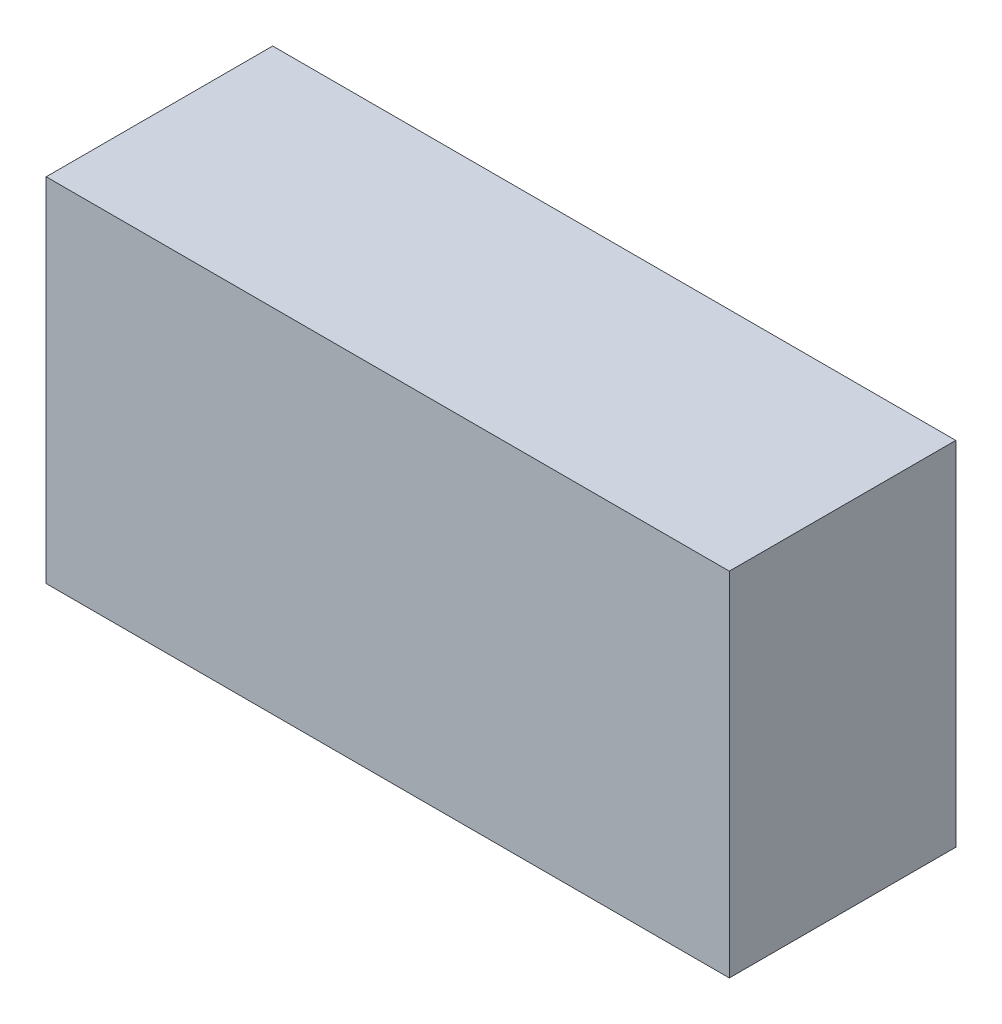
ISO-10303-21;
HEADER;
FILE_DESCRIPTION(('STEP AP214'),'2;1');
FILE_NAME('part.step','',(''),(''),'','','');
FILE_SCHEMA(('AUTOMOTIVE_DESIGN { 1 0 10303 214 1 1 1 1 }'));
ENDSEC;
DATA;
#1=APPLICATION_CONTEXT('core data for automotive mechanical design processes');
#2=APPLICATION_PROTOCOL_DEFINITION('international standard','automotive_design',2000,#1);
#3=PRODUCT_CONTEXT('',#1,'mechanical');
#4=PRODUCT('Part','Part','',(#3));
#5=PRODUCT_RELATED_PRODUCT_CATEGORY('part','',(#4));
#6=PRODUCT_DEFINITION_FORMATION('','',#4);
#7=PRODUCT_DEFINITION_CONTEXT('part definition',#1,'design');
#8=PRODUCT_DEFINITION('design','',#6,#7);
#9=PRODUCT_DEFINITION_SHAPE('','',#8);
#10=(LENGTH_UNIT() NAMED_UNIT(*) SI_UNIT(.MILLI.,.METRE.));
#11=(NAMED_UNIT(*) PLANE_ANGLE_UNIT() SI_UNIT($,.RADIAN.));
#12=(NAMED_UNIT(*) SI_UNIT($,.STERADIAN.) SOLID_ANGLE_UNIT());
#13=UNCERTAINTY_MEASURE_WITH_UNIT(LENGTH_MEASURE(1.E-05),#10,'distance_accuracy_value','');
#14=(GEOMETRIC_REPRESENTATION_CONTEXT(3) GLOBAL_UNCERTAINTY_ASSIGNED_CONTEXT((#13)) GLOBAL_UNIT_ASSIGNED_CONTEXT((#10,
#11,#12)) REPRESENTATION_CONTEXT('',''));
#15=CARTESIAN_POINT('',(0.,0.,0.));
#16=DIRECTION('',(0.,0.,1.));
#17=DIRECTION('',(1.,0.,0.));
#18=AXIS2_PLACEMENT_3D('',#15,#16,#17);
#19=CARTESIAN_POINT('',(0.,0.,0.8));
#20=DIRECTION('',(0.,0.,1.));
#21=DIRECTION('',(1.,0.,0.));
#22=AXIS2_PLACEMENT_3D('',#19,#20,#21);
#23=PLANE('',#22);
#24=DIRECTION('',(1.,0.,0.));
#25=VECTOR('',#24,1.);
#26=CARTESIAN_POINT('',(-1.2065,-0.6223,0.8));
#27=LINE('',#26,#25);
#28=CARTESIAN_POINT('',(-1.2065,-0.6223,0.8));
#29=VERTEX_POINT('',#28);
#30=CARTESIAN_POINT('',(1.2065,-0.6223,0.8));
#31=VERTEX_POINT('',#30);
#32=EDGE_CURVE('E99',#29,#31,#27,.T.);
#33=ORIENTED_EDGE('',*,*,#32,.T.);
#34=DIRECTION('',(0.,1.,0.));
#35=VECTOR('',#34,1.);
#36=CARTESIAN_POINT('',(1.2065,-0.6223,0.8));
#37=LINE('',#36,#35);
#38=CARTESIAN_POINT('',(1.2065,0.6223,0.8));
#39=VERTEX_POINT('',#38);
#40=EDGE_CURVE('E68',#31,#39,#37,.T.);
#41=ORIENTED_EDGE('',*,*,#40,.T.);
#42=DIRECTION('',(-1.,0.,0.));
#43=VECTOR('',#42,1.);
#44=CARTESIAN_POINT('',(1.2065,0.6223,0.8));
#45=LINE('',#44,#43);
#46=CARTESIAN_POINT('',(-1.2065,0.6223,0.8));
#47=VERTEX_POINT('',#46);
#48=EDGE_CURVE('E87',#39,#47,#45,.T.);
#49=ORIENTED_EDGE('',*,*,#48,.T.);
#50=DIRECTION('',(0.,-1.,0.));
#51=VECTOR('',#50,1.);
#52=CARTESIAN_POINT('',(-1.2065,0.6223,0.8));
#53=LINE('',#52,#51);
#54=EDGE_CURVE('E11',#47,#29,#53,.T.);
#55=ORIENTED_EDGE('',*,*,#54,.T.);
#56=EDGE_LOOP('',(#33,#41,#49,#55));
#57=FACE_BOUND('',#56,.T.);
#58=ADVANCED_FACE('F16',(#57),#23,.T.);
#59=CARTESIAN_POINT('',(0.,0.,0.));
#60=DIRECTION('',(0.,0.,1.));
#61=DIRECTION('',(1.,0.,0.));
#62=AXIS2_PLACEMENT_3D('',#59,#60,#61);
#63=PLANE('',#62);
#64=DIRECTION('',(1.,0.,0.));
#65=VECTOR('',#64,1.);
#66=CARTESIAN_POINT('',(-1.2065,-0.6223,0.));
#67=LINE('',#66,#65);
#68=CARTESIAN_POINT('',(-1.2065,-0.6223,0.));
#69=VERTEX_POINT('',#68);
#70=CARTESIAN_POINT('',(1.2065,-0.6223,0.));
#71=VERTEX_POINT('',#70);
#72=EDGE_CURVE('E90',#69,#71,#67,.T.);
#73=ORIENTED_EDGE('',*,*,#72,.F.);
#74=DIRECTION('',(0.,-1.,0.));
#75=VECTOR('',#74,1.);
#76=CARTESIAN_POINT('',(-1.2065,0.6223,0.));
#77=LINE('',#76,#75);
#78=CARTESIAN_POINT('',(-1.2065,0.6223,0.));
#79=VERTEX_POINT('',#78);
#80=EDGE_CURVE('E27',#79,#69,#77,.T.);
#81=ORIENTED_EDGE('',*,*,#80,.F.);
#82=DIRECTION('',(-1.,0.,0.));
#83=VECTOR('',#82,1.);
#84=CARTESIAN_POINT('',(1.2065,0.6223,0.));
#85=LINE('',#84,#83);
#86=CARTESIAN_POINT('',(1.2065,0.6223,0.));
#87=VERTEX_POINT('',#86);
#88=EDGE_CURVE('E55',#87,#79,#85,.T.);
#89=ORIENTED_EDGE('',*,*,#88,.F.);
#90=DIRECTION('',(0.,1.,0.));
#91=VECTOR('',#90,1.);
#92=CARTESIAN_POINT('',(1.2065,-0.6223,0.));
#93=LINE('',#92,#91);
#94=EDGE_CURVE('E93',#71,#87,#93,.T.);
#95=ORIENTED_EDGE('',*,*,#94,.F.);
#96=EDGE_LOOP('',(#73,#81,#89,#95));
#97=FACE_BOUND('',#96,.T.);
#98=ADVANCED_FACE('F91',(#97),#63,.F.);
#99=CARTESIAN_POINT('',(-1.2065,0.6223,0.));
#100=DIRECTION('',(1.,0.,0.));
#101=DIRECTION('',(0.,1.,0.));
#102=AXIS2_PLACEMENT_3D('',#99,#100,#101);
#103=PLANE('',#102);
#104=DIRECTION('',(0.,0.,1.));
#105=VECTOR('',#104,1.);
#106=CARTESIAN_POINT('',(-1.2065,0.6223,0.));
#107=LINE('',#106,#105);
#108=EDGE_CURVE('E85',#79,#47,#107,.T.);
#109=ORIENTED_EDGE('',*,*,#108,.F.);
#110=ORIENTED_EDGE('',*,*,#80,.T.);
#111=DIRECTION('',(0.,0.,1.));
#112=VECTOR('',#111,1.);
#113=CARTESIAN_POINT('',(-1.2065,-0.6223,0.));
#114=LINE('',#113,#112);
#115=EDGE_CURVE('E83',#69,#29,#114,.T.);
#116=ORIENTED_EDGE('',*,*,#115,.T.);
#117=ORIENTED_EDGE('',*,*,#54,.F.);
#118=EDGE_LOOP('',(#109,#110,#116,#117));
#119=FACE_BOUND('',#118,.T.);
#120=ADVANCED_FACE('F81',(#119),#103,.F.);
#121=CARTESIAN_POINT('',(1.2065,0.6223,0.));
#122=DIRECTION('',(0.,-1.,0.));
#123=DIRECTION('',(0.,0.,-1.));
#124=AXIS2_PLACEMENT_3D('',#121,#122,#123);
#125=PLANE('',#124);
#126=DIRECTION('',(0.,0.,1.));
#127=VECTOR('',#126,1.);
#128=CARTESIAN_POINT('',(1.2065,0.6223,0.));
#129=LINE('',#128,#127);
#130=EDGE_CURVE('E106',#87,#39,#129,.T.);
#131=ORIENTED_EDGE('',*,*,#130,.F.);
#132=ORIENTED_EDGE('',*,*,#88,.T.);
#133=ORIENTED_EDGE('',*,*,#108,.T.);
#134=ORIENTED_EDGE('',*,*,#48,.F.);
#135=EDGE_LOOP('',(#131,#132,#133,#134));
#136=FACE_BOUND('',#135,.T.);
#137=ADVANCED_FACE('F122',(#136),#125,.F.);
#138=CARTESIAN_POINT('',(1.2065,-0.6223,0.));
#139=DIRECTION('',(-1.,0.,0.));
#140=DIRECTION('',(0.,0.,1.));
#141=AXIS2_PLACEMENT_3D('',#138,#139,#140);
#142=PLANE('',#141);
#143=DIRECTION('',(0.,0.,1.));
#144=VECTOR('',#143,1.);
#145=CARTESIAN_POINT('',(1.2065,-0.6223,0.));
#146=LINE('',#145,#144);
#147=EDGE_CURVE('E20',#71,#31,#146,.T.);
#148=ORIENTED_EDGE('',*,*,#147,.F.);
#149=ORIENTED_EDGE('',*,*,#94,.T.);
#150=ORIENTED_EDGE('',*,*,#130,.T.);
#151=ORIENTED_EDGE('',*,*,#40,.F.);
#152=EDGE_LOOP('',(#148,#149,#150,#151));
#153=FACE_BOUND('',#152,.T.);
#154=ADVANCED_FACE('F18',(#153),#142,.F.);
#155=CARTESIAN_POINT('',(-1.2065,-0.6223,0.));
#156=DIRECTION('',(0.,1.,0.));
#157=DIRECTION('',(1.,0.,0.));
#158=AXIS2_PLACEMENT_3D('',#155,#156,#157);
#159=PLANE('',#158);
#160=ORIENTED_EDGE('',*,*,#115,.F.);
#161=ORIENTED_EDGE('',*,*,#72,.T.);
#162=ORIENTED_EDGE('',*,*,#147,.T.);
#163=ORIENTED_EDGE('',*,*,#32,.F.);
#164=EDGE_LOOP('',(#160,#161,#162,#163));
#165=FACE_BOUND('',#164,.T.);
#166=ADVANCED_FACE('F98',(#165),#159,.F.);
#167=CLOSED_SHELL('',(#58,#98,#120,#137,#154,#166));
#168=MANIFOLD_SOLID_BREP('B1',#167);
#169=ADVANCED_BREP_SHAPE_REPRESENTATION('',(#18,#168),#14);
#170=SHAPE_DEFINITION_REPRESENTATION(#9,#169);
ENDSEC;
END-ISO-10303-21;
